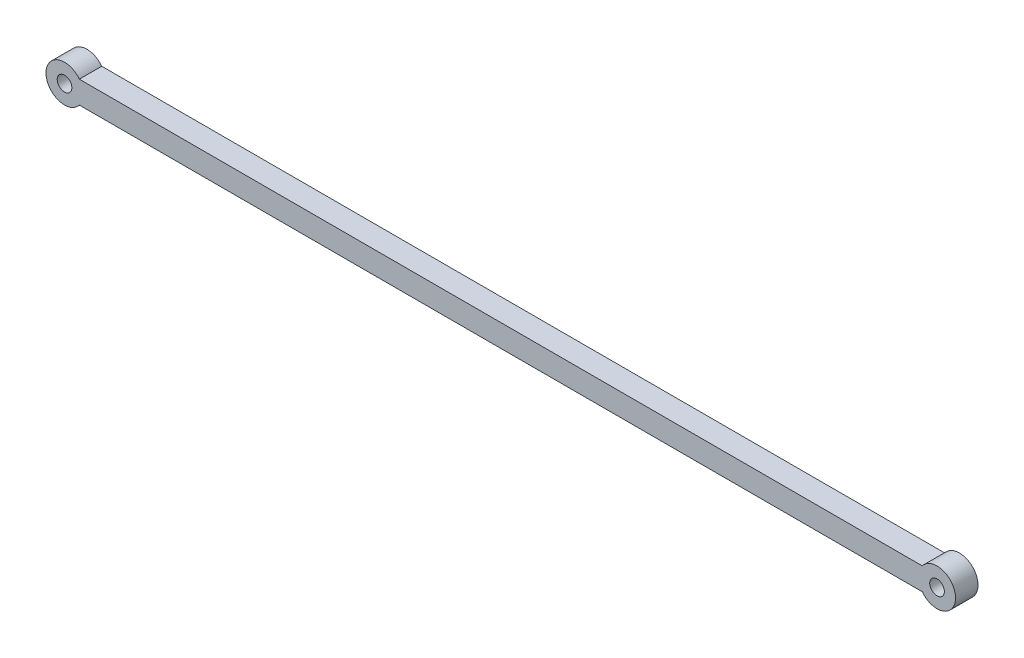
ISO-10303-21;
HEADER;
FILE_DESCRIPTION(('STEP AP214'),'2;1');
FILE_NAME('part.step','',(''),(''),'','','');
FILE_SCHEMA(('AUTOMOTIVE_DESIGN { 1 0 10303 214 1 1 1 1 }'));
ENDSEC;
DATA;
#1=APPLICATION_CONTEXT('core data for automotive mechanical design processes');
#2=APPLICATION_PROTOCOL_DEFINITION('international standard','automotive_design',2000,#1);
#3=PRODUCT_CONTEXT('',#1,'mechanical');
#4=PRODUCT('Part','Part','',(#3));
#5=PRODUCT_RELATED_PRODUCT_CATEGORY('part','',(#4));
#6=PRODUCT_DEFINITION_FORMATION('','',#4);
#7=PRODUCT_DEFINITION_CONTEXT('part definition',#1,'design');
#8=PRODUCT_DEFINITION('design','',#6,#7);
#9=PRODUCT_DEFINITION_SHAPE('','',#8);
#10=(LENGTH_UNIT() NAMED_UNIT(*) SI_UNIT(.MILLI.,.METRE.));
#11=(NAMED_UNIT(*) PLANE_ANGLE_UNIT() SI_UNIT($,.RADIAN.));
#12=(NAMED_UNIT(*) SI_UNIT($,.STERADIAN.) SOLID_ANGLE_UNIT());
#13=UNCERTAINTY_MEASURE_WITH_UNIT(LENGTH_MEASURE(1.E-05),#10,'distance_accuracy_value','');
#14=(GEOMETRIC_REPRESENTATION_CONTEXT(3) GLOBAL_UNCERTAINTY_ASSIGNED_CONTEXT((#13)) GLOBAL_UNIT_ASSIGNED_CONTEXT((#10,
#11,#12)) REPRESENTATION_CONTEXT('',''));
#15=CARTESIAN_POINT('',(0.,0.,0.));
#16=DIRECTION('',(0.,0.,1.));
#17=DIRECTION('',(1.,0.,0.));
#18=AXIS2_PLACEMENT_3D('',#15,#16,#17);
#19=CARTESIAN_POINT('',(-610.888476575822,10.97625,10.97625));
#20=DIRECTION('',(0.,1.,0.));
#21=DIRECTION('',(0.,0.,1.));
#22=AXIS2_PLACEMENT_3D('',#19,#20,#21);
#23=PLANE('',#22);
#24=DIRECTION('',(1.,0.,0.));
#25=VECTOR('',#24,1.);
#26=CARTESIAN_POINT('',(-610.888476575822,10.97625,-10.97625));
#27=LINE('',#26,#25);
#28=CARTESIAN_POINT('',(-610.888476575822,10.97625,-10.97625));
#29=VERTEX_POINT('',#28);
#30=CARTESIAN_POINT('',(214.584651223709,10.97625,-10.97625));
#31=VERTEX_POINT('',#30);
#32=EDGE_CURVE('E141',#29,#31,#27,.T.);
#33=ORIENTED_EDGE('',*,*,#32,.F.);
#34=DIRECTION('',(0.,0.,-1.));
#35=VECTOR('',#34,1.);
#36=CARTESIAN_POINT('',(-610.888476575822,10.97625,10.97625));
#37=LINE('',#36,#35);
#38=CARTESIAN_POINT('',(-610.888476575822,10.97625,10.97625));
#39=VERTEX_POINT('',#38);
#40=EDGE_CURVE('E95',#39,#29,#37,.T.);
#41=ORIENTED_EDGE('',*,*,#40,.F.);
#42=DIRECTION('',(1.,0.,0.));
#43=VECTOR('',#42,1.);
#44=CARTESIAN_POINT('',(-610.888476575822,10.97625,10.97625));
#45=LINE('',#44,#43);
#46=CARTESIAN_POINT('',(214.584651223709,10.97625,10.97625));
#47=VERTEX_POINT('',#46);
#48=EDGE_CURVE('E140',#39,#47,#45,.T.);
#49=ORIENTED_EDGE('',*,*,#48,.T.);
#50=DIRECTION('',(0.,0.,-1.));
#51=VECTOR('',#50,1.);
#52=CARTESIAN_POINT('',(214.584651223709,10.97625,10.97625));
#53=LINE('',#52,#51);
#54=EDGE_CURVE('E108',#47,#31,#53,.T.);
#55=ORIENTED_EDGE('',*,*,#54,.T.);
#56=EDGE_LOOP('',(#33,#41,#49,#55));
#57=FACE_BOUND('',#56,.T.);
#58=ADVANCED_FACE('F75',(#57),#23,.T.);
#59=CARTESIAN_POINT('',(-610.888476575822,-10.97625,10.97625));
#60=DIRECTION('',(0.,1.,0.));
#61=DIRECTION('',(0.,0.,1.));
#62=AXIS2_PLACEMENT_3D('',#59,#60,#61);
#63=PLANE('',#62);
#64=DIRECTION('',(1.,0.,0.));
#65=VECTOR('',#64,1.);
#66=CARTESIAN_POINT('',(-610.888476575822,-10.97625,-10.97625));
#67=LINE('',#66,#65);
#68=CARTESIAN_POINT('',(-610.888476575822,-10.97625,-10.97625));
#69=VERTEX_POINT('',#68);
#70=CARTESIAN_POINT('',(214.584651223709,-10.97625,-10.97625));
#71=VERTEX_POINT('',#70);
#72=EDGE_CURVE('E126',#69,#71,#67,.T.);
#73=ORIENTED_EDGE('',*,*,#72,.T.);
#74=DIRECTION('',(0.,0.,-1.));
#75=VECTOR('',#74,1.);
#76=CARTESIAN_POINT('',(214.584651223709,-10.97625,10.97625));
#77=LINE('',#76,#75);
#78=CARTESIAN_POINT('',(214.584651223709,-10.97625,10.97625));
#79=VERTEX_POINT('',#78);
#80=EDGE_CURVE('E86',#79,#71,#77,.T.);
#81=ORIENTED_EDGE('',*,*,#80,.F.);
#82=DIRECTION('',(1.,0.,0.));
#83=VECTOR('',#82,1.);
#84=CARTESIAN_POINT('',(-610.888476575822,-10.97625,10.97625));
#85=LINE('',#84,#83);
#86=CARTESIAN_POINT('',(-610.888476575822,-10.97625,10.97625));
#87=VERTEX_POINT('',#86);
#88=EDGE_CURVE('E124',#87,#79,#85,.T.);
#89=ORIENTED_EDGE('',*,*,#88,.F.);
#90=DIRECTION('',(0.,0.,-1.));
#91=VECTOR('',#90,1.);
#92=CARTESIAN_POINT('',(-610.888476575822,-10.97625,10.97625));
#93=LINE('',#92,#91);
#94=EDGE_CURVE('E12',#87,#69,#93,.T.);
#95=ORIENTED_EDGE('',*,*,#94,.T.);
#96=EDGE_LOOP('',(#73,#81,#89,#95));
#97=FACE_BOUND('',#96,.T.);
#98=ADVANCED_FACE('F122',(#97),#63,.F.);
#99=CARTESIAN_POINT('',(0.,0.,-10.97625));
#100=DIRECTION('',(0.,0.,1.));
#101=DIRECTION('',(1.,0.,0.));
#102=AXIS2_PLACEMENT_3D('',#99,#100,#101);
#103=PLANE('',#102);
#104=CARTESIAN_POINT('',(-625.352112676056,0.,-10.97625));
#105=DIRECTION('',(0.,0.,1.));
#106=DIRECTION('',(1.,0.,0.));
#107=AXIS2_PLACEMENT_3D('',#104,#105,#106);
#108=CIRCLE('',#107,7.1807);
#109=CARTESIAN_POINT('',(-618.171412676056,0.,-10.97625));
#110=VERTEX_POINT('',#109);
#111=EDGE_CURVE('E165',#110,#110,#108,.T.);
#112=ORIENTED_EDGE('',*,*,#111,.T.);
#113=EDGE_LOOP('',(#112));
#114=FACE_BOUND('',#113,.T.);
#115=CARTESIAN_POINT('',(229.048287323944,0.,-10.97625));
#116=DIRECTION('',(0.,0.,1.));
#117=DIRECTION('',(1.,0.,0.));
#118=AXIS2_PLACEMENT_3D('',#115,#116,#117);
#119=CIRCLE('',#118,7.18069999999999);
#120=CARTESIAN_POINT('',(236.228987323944,0.,-10.97625));
#121=VERTEX_POINT('',#120);
#122=EDGE_CURVE('E149',#121,#121,#119,.T.);
#123=ORIENTED_EDGE('',*,*,#122,.T.);
#124=EDGE_LOOP('',(#123));
#125=FACE_BOUND('',#124,.T.);
#126=ORIENTED_EDGE('',*,*,#72,.F.);
#127=CARTESIAN_POINT('',(-625.352112676056,0.,-10.97625));
#128=DIRECTION('',(0.,0.,1.));
#129=DIRECTION('',(1.,0.,0.));
#130=AXIS2_PLACEMENT_3D('',#127,#128,#129);
#131=CIRCLE('',#130,18.1569499999999);
#132=EDGE_CURVE('E136',#29,#69,#131,.T.);
#133=ORIENTED_EDGE('',*,*,#132,.F.);
#134=ORIENTED_EDGE('',*,*,#32,.T.);
#135=CARTESIAN_POINT('',(229.048287323944,0.,-10.97625));
#136=DIRECTION('',(0.,0.,1.));
#137=DIRECTION('',(1.,0.,0.));
#138=AXIS2_PLACEMENT_3D('',#135,#136,#137);
#139=CIRCLE('',#138,18.1569499999999);
#140=EDGE_CURVE('E79',#71,#31,#139,.T.);
#141=ORIENTED_EDGE('',*,*,#140,.F.);
#142=EDGE_LOOP('',(#126,#133,#134,#141));
#143=FACE_BOUND('',#142,.T.);
#144=ADVANCED_FACE('F163',(#114,#125,#143),#103,.F.);
#145=CARTESIAN_POINT('',(0.,0.,10.97625));
#146=DIRECTION('',(0.,0.,1.));
#147=DIRECTION('',(1.,0.,0.));
#148=AXIS2_PLACEMENT_3D('',#145,#146,#147);
#149=PLANE('',#148);
#150=CARTESIAN_POINT('',(-625.352112676056,0.,10.97625));
#151=DIRECTION('',(0.,0.,1.));
#152=DIRECTION('',(1.,0.,0.));
#153=AXIS2_PLACEMENT_3D('',#150,#151,#152);
#154=CIRCLE('',#153,7.1807);
#155=CARTESIAN_POINT('',(-618.171412676056,0.,10.97625));
#156=VERTEX_POINT('',#155);
#157=EDGE_CURVE('E168',#156,#156,#154,.T.);
#158=ORIENTED_EDGE('',*,*,#157,.F.);
#159=EDGE_LOOP('',(#158));
#160=FACE_BOUND('',#159,.T.);
#161=CARTESIAN_POINT('',(229.048287323944,0.,10.97625));
#162=DIRECTION('',(0.,0.,1.));
#163=DIRECTION('',(1.,0.,0.));
#164=AXIS2_PLACEMENT_3D('',#161,#162,#163);
#165=CIRCLE('',#164,7.18069999999999);
#166=CARTESIAN_POINT('',(236.228987323944,0.,10.97625));
#167=VERTEX_POINT('',#166);
#168=EDGE_CURVE('E174',#167,#167,#165,.T.);
#169=ORIENTED_EDGE('',*,*,#168,.F.);
#170=EDGE_LOOP('',(#169));
#171=FACE_BOUND('',#170,.T.);
#172=ORIENTED_EDGE('',*,*,#48,.F.);
#173=CARTESIAN_POINT('',(-625.352112676056,0.,10.97625));
#174=DIRECTION('',(0.,0.,1.));
#175=DIRECTION('',(1.,0.,0.));
#176=AXIS2_PLACEMENT_3D('',#173,#174,#175);
#177=CIRCLE('',#176,18.1569499999999);
#178=EDGE_CURVE('E138',#39,#87,#177,.T.);
#179=ORIENTED_EDGE('',*,*,#178,.T.);
#180=ORIENTED_EDGE('',*,*,#88,.T.);
#181=CARTESIAN_POINT('',(229.048287323944,0.,10.97625));
#182=DIRECTION('',(0.,0.,1.));
#183=DIRECTION('',(1.,0.,0.));
#184=AXIS2_PLACEMENT_3D('',#181,#182,#183);
#185=CIRCLE('',#184,18.1569499999999);
#186=EDGE_CURVE('E132',#79,#47,#185,.T.);
#187=ORIENTED_EDGE('',*,*,#186,.T.);
#188=EDGE_LOOP('',(#172,#179,#180,#187));
#189=FACE_BOUND('',#188,.T.);
#190=ADVANCED_FACE('F137',(#160,#171,#189),#149,.T.);
#191=CARTESIAN_POINT('',(229.048287323944,0.,10.97625));
#192=DIRECTION('',(0.,0.,-1.));
#193=DIRECTION('',(-1.,0.,0.));
#194=AXIS2_PLACEMENT_3D('',#191,#192,#193);
#195=CYLINDRICAL_SURFACE('',#194,18.1569499999999);
#196=ORIENTED_EDGE('',*,*,#80,.T.);
#197=ORIENTED_EDGE('',*,*,#140,.T.);
#198=ORIENTED_EDGE('',*,*,#54,.F.);
#199=ORIENTED_EDGE('',*,*,#186,.F.);
#200=EDGE_LOOP('',(#196,#197,#198,#199));
#201=FACE_BOUND('',#200,.T.);
#202=ADVANCED_FACE('F77',(#201),#195,.T.);
#203=CARTESIAN_POINT('',(-625.352112676056,0.,10.97625));
#204=DIRECTION('',(0.,0.,-1.));
#205=DIRECTION('',(-1.,0.,0.));
#206=AXIS2_PLACEMENT_3D('',#203,#204,#205);
#207=CYLINDRICAL_SURFACE('',#206,18.1569499999999);
#208=ORIENTED_EDGE('',*,*,#132,.T.);
#209=ORIENTED_EDGE('',*,*,#94,.F.);
#210=ORIENTED_EDGE('',*,*,#178,.F.);
#211=ORIENTED_EDGE('',*,*,#40,.T.);
#212=EDGE_LOOP('',(#208,#209,#210,#211));
#213=FACE_BOUND('',#212,.T.);
#214=ADVANCED_FACE('F161',(#213),#207,.T.);
#215=CARTESIAN_POINT('',(229.048287323944,0.,-10.97625));
#216=DIRECTION('',(0.,0.,1.));
#217=DIRECTION('',(1.,0.,0.));
#218=AXIS2_PLACEMENT_3D('',#215,#216,#217);
#219=CYLINDRICAL_SURFACE('',#218,7.18069999999999);
#220=CARTESIAN_POINT('',(236.228987323944,0.,-10.97625));
#221=CARTESIAN_POINT('',(236.228987323944,0.,-10.747578125));
#222=CARTESIAN_POINT('',(236.228987323944,0.,-10.51890625));
#223=CARTESIAN_POINT('',(236.228987323944,0.,-10.0615625));
#224=CARTESIAN_POINT('',(236.228987323944,0.,-9.832890625));
#225=CARTESIAN_POINT('',(236.228987323944,0.,-9.375546875));
#226=CARTESIAN_POINT('',(236.228987323944,0.,-9.146875));
#227=CARTESIAN_POINT('',(236.228987323944,0.,-8.68953125));
#228=CARTESIAN_POINT('',(236.228987323944,0.,-8.460859375));
#229=CARTESIAN_POINT('',(236.228987323944,0.,-8.003515625));
#230=CARTESIAN_POINT('',(236.228987323944,0.,-7.77484375));
#231=CARTESIAN_POINT('',(236.228987323944,0.,-7.3175));
#232=CARTESIAN_POINT('',(236.228987323944,0.,-7.088828125));
#233=CARTESIAN_POINT('',(236.228987323944,0.,-6.631484375));
#234=CARTESIAN_POINT('',(236.228987323944,0.,-6.4028125));
#235=CARTESIAN_POINT('',(236.228987323944,0.,-5.94546875));
#236=CARTESIAN_POINT('',(236.228987323944,0.,-5.716796875));
#237=CARTESIAN_POINT('',(236.228987323944,0.,-5.259453125));
#238=CARTESIAN_POINT('',(236.228987323944,0.,-5.03078125));
#239=CARTESIAN_POINT('',(236.228987323944,0.,-4.5734375));
#240=CARTESIAN_POINT('',(236.228987323944,0.,-4.344765625));
#241=CARTESIAN_POINT('',(236.228987323944,0.,-3.887421875));
#242=CARTESIAN_POINT('',(236.228987323944,0.,-3.65875));
#243=CARTESIAN_POINT('',(236.228987323944,0.,-3.20140625));
#244=CARTESIAN_POINT('',(236.228987323944,0.,-2.972734375));
#245=CARTESIAN_POINT('',(236.228987323944,0.,-2.515390625));
#246=CARTESIAN_POINT('',(236.228987323944,0.,-2.28671875));
#247=CARTESIAN_POINT('',(236.228987323944,0.,-1.829375));
#248=CARTESIAN_POINT('',(236.228987323944,0.,-1.600703125));
#249=CARTESIAN_POINT('',(236.228987323944,0.,-1.143359375));
#250=CARTESIAN_POINT('',(236.228987323944,0.,-0.914687500000001));
#251=CARTESIAN_POINT('',(236.228987323944,0.,-0.457343750000001));
#252=CARTESIAN_POINT('',(236.228987323944,0.,-0.228671875000002));
#253=CARTESIAN_POINT('',(236.228987323944,0.,0.228671874999998));
#254=CARTESIAN_POINT('',(236.228987323944,0.,0.457343749999998));
#255=CARTESIAN_POINT('',(236.228987323944,0.,0.914687499999998));
#256=CARTESIAN_POINT('',(236.228987323944,0.,1.143359375));
#257=CARTESIAN_POINT('',(236.228987323944,0.,1.600703125));
#258=CARTESIAN_POINT('',(236.228987323944,0.,1.829375));
#259=CARTESIAN_POINT('',(236.228987323944,0.,2.28671875));
#260=CARTESIAN_POINT('',(236.228987323944,0.,2.515390625));
#261=CARTESIAN_POINT('',(236.228987323944,0.,2.972734375));
#262=CARTESIAN_POINT('',(236.228987323944,0.,3.20140625));
#263=CARTESIAN_POINT('',(236.228987323944,0.,3.65875));
#264=CARTESIAN_POINT('',(236.228987323944,0.,3.887421875));
#265=CARTESIAN_POINT('',(236.228987323944,0.,4.344765625));
#266=CARTESIAN_POINT('',(236.228987323944,0.,4.5734375));
#267=CARTESIAN_POINT('',(236.228987323944,0.,5.03078125));
#268=CARTESIAN_POINT('',(236.228987323944,0.,5.259453125));
#269=CARTESIAN_POINT('',(236.228987323944,0.,5.716796875));
#270=CARTESIAN_POINT('',(236.228987323944,0.,5.94546875));
#271=CARTESIAN_POINT('',(236.228987323944,0.,6.4028125));
#272=CARTESIAN_POINT('',(236.228987323944,0.,6.631484375));
#273=CARTESIAN_POINT('',(236.228987323944,0.,7.088828125));
#274=CARTESIAN_POINT('',(236.228987323944,0.,7.3175));
#275=CARTESIAN_POINT('',(236.228987323944,0.,7.77484375));
#276=CARTESIAN_POINT('',(236.228987323944,0.,8.003515625));
#277=CARTESIAN_POINT('',(236.228987323944,0.,8.460859375));
#278=CARTESIAN_POINT('',(236.228987323944,0.,8.68953125));
#279=CARTESIAN_POINT('',(236.228987323944,0.,9.146875));
#280=CARTESIAN_POINT('',(236.228987323944,0.,9.375546875));
#281=CARTESIAN_POINT('',(236.228987323944,0.,9.832890625));
#282=CARTESIAN_POINT('',(236.228987323944,0.,10.0615625));
#283=CARTESIAN_POINT('',(236.228987323944,0.,10.51890625));
#284=CARTESIAN_POINT('',(236.228987323944,0.,10.747578125));
#285=CARTESIAN_POINT('',(236.228987323944,0.,10.97625));
#286=B_SPLINE_CURVE_WITH_KNOTS('',3,(#220,#221,#222,#223,#224,#225,#226,#227,#228,#229,#230,
#231,#232,#233,#234,#235,#236,#237,#238,#239,#240,#241,#242,#243,#244,#245,#246,#247,#248,#249,
#250,#251,#252,#253,#254,#255,#256,#257,#258,#259,#260,#261,#262,#263,#264,#265,#266,#267,#268,
#269,#270,#271,#272,#273,#274,#275,#276,#277,#278,#279,#280,#281,#282,#283,#284,#285),
.UNSPECIFIED.,.F.,.F.,(4,2,2,2,2,2,2,2,2,2,2,2,2,2,2,2,2,2,2,2,2,2,2,2,2,2,2,2,2,2,2,2,4),(0.,
0.686015625,1.37203125,2.058046875,2.7440625,3.430078125,4.11609375,4.802109375,5.488125,
6.174140625,6.86015625,7.546171875,8.2321875,8.918203125,9.60421875,10.290234375,10.97625,
11.662265625,12.34828125,13.034296875,13.7203125,14.406328125,15.09234375,15.778359375,
16.464375,17.150390625,17.83640625,18.522421875,19.2084375,19.894453125,20.58046875,
21.266484375,21.9525),.UNSPECIFIED.);
#287=EDGE_CURVE('BSEAM185',#121,#167,#286,.T.);
#288=ORIENTED_EDGE('',*,*,#122,.F.);
#289=ORIENTED_EDGE('',*,*,#168,.T.);
#290=ORIENTED_EDGE('',*,*,#287,.T.);
#291=ORIENTED_EDGE('',*,*,#287,.F.);
#292=EDGE_LOOP('',(#288,#290,#289,#291));
#293=FACE_BOUND('',#292,.T.);
#294=ADVANCED_FACE('F185',(#293),#219,.F.);
#295=CARTESIAN_POINT('',(-625.352112676056,0.,-10.97625));
#296=DIRECTION('',(0.,0.,1.));
#297=DIRECTION('',(1.,0.,0.));
#298=AXIS2_PLACEMENT_3D('',#295,#296,#297);
#299=CYLINDRICAL_SURFACE('',#298,7.1807);
#300=CARTESIAN_POINT('',(-618.171412676056,0.,-10.97625));
#301=CARTESIAN_POINT('',(-618.171412676056,0.,-10.747578125));
#302=CARTESIAN_POINT('',(-618.171412676056,0.,-10.51890625));
#303=CARTESIAN_POINT('',(-618.171412676056,0.,-10.0615625));
#304=CARTESIAN_POINT('',(-618.171412676056,0.,-9.832890625));
#305=CARTESIAN_POINT('',(-618.171412676056,0.,-9.375546875));
#306=CARTESIAN_POINT('',(-618.171412676056,0.,-9.146875));
#307=CARTESIAN_POINT('',(-618.171412676056,0.,-8.68953125));
#308=CARTESIAN_POINT('',(-618.171412676056,0.,-8.460859375));
#309=CARTESIAN_POINT('',(-618.171412676056,0.,-8.003515625));
#310=CARTESIAN_POINT('',(-618.171412676056,0.,-7.77484375));
#311=CARTESIAN_POINT('',(-618.171412676056,0.,-7.3175));
#312=CARTESIAN_POINT('',(-618.171412676056,0.,-7.088828125));
#313=CARTESIAN_POINT('',(-618.171412676056,0.,-6.631484375));
#314=CARTESIAN_POINT('',(-618.171412676056,0.,-6.4028125));
#315=CARTESIAN_POINT('',(-618.171412676056,0.,-5.94546875));
#316=CARTESIAN_POINT('',(-618.171412676056,0.,-5.716796875));
#317=CARTESIAN_POINT('',(-618.171412676056,0.,-5.259453125));
#318=CARTESIAN_POINT('',(-618.171412676056,0.,-5.03078125));
#319=CARTESIAN_POINT('',(-618.171412676056,0.,-4.5734375));
#320=CARTESIAN_POINT('',(-618.171412676056,0.,-4.344765625));
#321=CARTESIAN_POINT('',(-618.171412676056,0.,-3.887421875));
#322=CARTESIAN_POINT('',(-618.171412676056,0.,-3.65875));
#323=CARTESIAN_POINT('',(-618.171412676056,0.,-3.20140625));
#324=CARTESIAN_POINT('',(-618.171412676056,0.,-2.972734375));
#325=CARTESIAN_POINT('',(-618.171412676056,0.,-2.515390625));
#326=CARTESIAN_POINT('',(-618.171412676056,0.,-2.28671875));
#327=CARTESIAN_POINT('',(-618.171412676056,0.,-1.829375));
#328=CARTESIAN_POINT('',(-618.171412676056,0.,-1.600703125));
#329=CARTESIAN_POINT('',(-618.171412676056,0.,-1.143359375));
#330=CARTESIAN_POINT('',(-618.171412676056,0.,-0.914687500000001));
#331=CARTESIAN_POINT('',(-618.171412676056,0.,-0.457343750000001));
#332=CARTESIAN_POINT('',(-618.171412676056,0.,-0.228671875000002));
#333=CARTESIAN_POINT('',(-618.171412676056,0.,0.228671874999998));
#334=CARTESIAN_POINT('',(-618.171412676056,0.,0.457343749999998));
#335=CARTESIAN_POINT('',(-618.171412676056,0.,0.914687499999998));
#336=CARTESIAN_POINT('',(-618.171412676056,0.,1.143359375));
#337=CARTESIAN_POINT('',(-618.171412676056,0.,1.600703125));
#338=CARTESIAN_POINT('',(-618.171412676056,0.,1.829375));
#339=CARTESIAN_POINT('',(-618.171412676056,0.,2.28671875));
#340=CARTESIAN_POINT('',(-618.171412676056,0.,2.515390625));
#341=CARTESIAN_POINT('',(-618.171412676056,0.,2.972734375));
#342=CARTESIAN_POINT('',(-618.171412676056,0.,3.20140625));
#343=CARTESIAN_POINT('',(-618.171412676056,0.,3.65875));
#344=CARTESIAN_POINT('',(-618.171412676056,0.,3.887421875));
#345=CARTESIAN_POINT('',(-618.171412676056,0.,4.344765625));
#346=CARTESIAN_POINT('',(-618.171412676056,0.,4.5734375));
#347=CARTESIAN_POINT('',(-618.171412676056,0.,5.03078125));
#348=CARTESIAN_POINT('',(-618.171412676056,0.,5.259453125));
#349=CARTESIAN_POINT('',(-618.171412676056,0.,5.716796875));
#350=CARTESIAN_POINT('',(-618.171412676056,0.,5.94546875));
#351=CARTESIAN_POINT('',(-618.171412676056,0.,6.4028125));
#352=CARTESIAN_POINT('',(-618.171412676056,0.,6.631484375));
#353=CARTESIAN_POINT('',(-618.171412676056,0.,7.088828125));
#354=CARTESIAN_POINT('',(-618.171412676056,0.,7.3175));
#355=CARTESIAN_POINT('',(-618.171412676056,0.,7.77484375));
#356=CARTESIAN_POINT('',(-618.171412676056,0.,8.003515625));
#357=CARTESIAN_POINT('',(-618.171412676056,0.,8.460859375));
#358=CARTESIAN_POINT('',(-618.171412676056,0.,8.68953125));
#359=CARTESIAN_POINT('',(-618.171412676056,0.,9.146875));
#360=CARTESIAN_POINT('',(-618.171412676056,0.,9.375546875));
#361=CARTESIAN_POINT('',(-618.171412676056,0.,9.832890625));
#362=CARTESIAN_POINT('',(-618.171412676056,0.,10.0615625));
#363=CARTESIAN_POINT('',(-618.171412676056,0.,10.51890625));
#364=CARTESIAN_POINT('',(-618.171412676056,0.,10.747578125));
#365=CARTESIAN_POINT('',(-618.171412676056,0.,10.97625));
#366=B_SPLINE_CURVE_WITH_KNOTS('',3,(#300,#301,#302,#303,#304,#305,#306,#307,#308,#309,#310,
#311,#312,#313,#314,#315,#316,#317,#318,#319,#320,#321,#322,#323,#324,#325,#326,#327,#328,#329,
#330,#331,#332,#333,#334,#335,#336,#337,#338,#339,#340,#341,#342,#343,#344,#345,#346,#347,#348,
#349,#350,#351,#352,#353,#354,#355,#356,#357,#358,#359,#360,#361,#362,#363,#364,#365),
.UNSPECIFIED.,.F.,.F.,(4,2,2,2,2,2,2,2,2,2,2,2,2,2,2,2,2,2,2,2,2,2,2,2,2,2,2,2,2,2,2,2,4),(0.,
0.686015625,1.37203125,2.058046875,2.7440625,3.430078125,4.11609375,4.802109375,5.488125,
6.174140625,6.86015625,7.546171875,8.2321875,8.918203125,9.60421875,10.290234375,10.97625,
11.662265625,12.34828125,13.034296875,13.7203125,14.406328125,15.09234375,15.778359375,
16.464375,17.150390625,17.83640625,18.522421875,19.2084375,19.894453125,20.58046875,
21.266484375,21.9525),.UNSPECIFIED.);
#367=EDGE_CURVE('BSEAM187',#110,#156,#366,.T.);
#368=ORIENTED_EDGE('',*,*,#111,.F.);
#369=ORIENTED_EDGE('',*,*,#157,.T.);
#370=ORIENTED_EDGE('',*,*,#367,.T.);
#371=ORIENTED_EDGE('',*,*,#367,.F.);
#372=EDGE_LOOP('',(#368,#370,#369,#371));
#373=FACE_BOUND('',#372,.T.);
#374=ADVANCED_FACE('F187',(#373),#299,.F.);
#375=CLOSED_SHELL('',(#58,#98,#144,#190,#202,#214,#294,#374));
#376=MANIFOLD_SOLID_BREP('B2',#375);
#377=ADVANCED_BREP_SHAPE_REPRESENTATION('',(#18,#376),#14);
#378=SHAPE_DEFINITION_REPRESENTATION(#9,#377);
ENDSEC;
END-ISO-10303-21;
